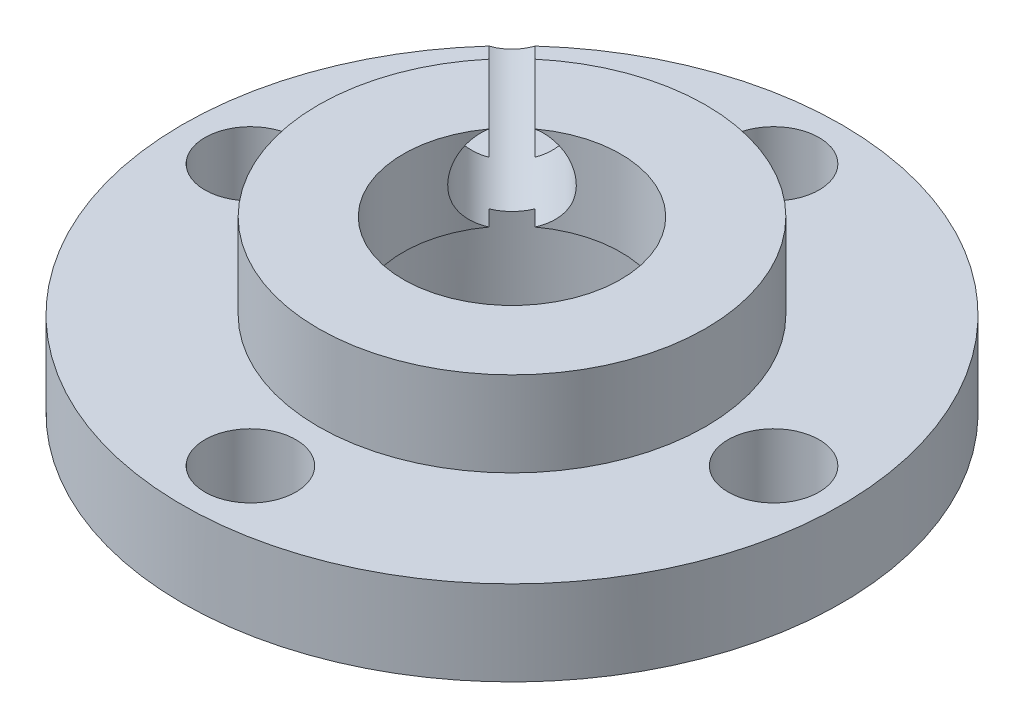
ISO-10303-21;
HEADER;
FILE_DESCRIPTION(('STEP AP214'),'2;1');
FILE_NAME('part.step','',(''),(''),'','','');
FILE_SCHEMA(('AUTOMOTIVE_DESIGN { 1 0 10303 214 1 1 1 1 }'));
ENDSEC;
DATA;
#1=APPLICATION_CONTEXT('core data for automotive mechanical design processes');
#2=APPLICATION_PROTOCOL_DEFINITION('international standard','automotive_design',2000,#1);
#3=PRODUCT_CONTEXT('',#1,'mechanical');
#4=PRODUCT('Part','Part','',(#3));
#5=PRODUCT_RELATED_PRODUCT_CATEGORY('part','',(#4));
#6=PRODUCT_DEFINITION_FORMATION('','',#4);
#7=PRODUCT_DEFINITION_CONTEXT('part definition',#1,'design');
#8=PRODUCT_DEFINITION('design','',#6,#7);
#9=PRODUCT_DEFINITION_SHAPE('','',#8);
#10=(LENGTH_UNIT() NAMED_UNIT(*) SI_UNIT(.MILLI.,.METRE.));
#11=(NAMED_UNIT(*) PLANE_ANGLE_UNIT() SI_UNIT($,.RADIAN.));
#12=(NAMED_UNIT(*) SI_UNIT($,.STERADIAN.) SOLID_ANGLE_UNIT());
#13=UNCERTAINTY_MEASURE_WITH_UNIT(LENGTH_MEASURE(1.E-05),#10,'distance_accuracy_value','');
#14=(GEOMETRIC_REPRESENTATION_CONTEXT(3) GLOBAL_UNCERTAINTY_ASSIGNED_CONTEXT((#13)) GLOBAL_UNIT_ASSIGNED_CONTEXT((#10,
#11,#12)) REPRESENTATION_CONTEXT('',''));
#15=CARTESIAN_POINT('',(0.,0.,0.));
#16=DIRECTION('',(0.,0.,1.));
#17=DIRECTION('',(1.,0.,0.));
#18=AXIS2_PLACEMENT_3D('',#15,#16,#17);
#19=CARTESIAN_POINT('',(0.,6.35,0.));
#20=DIRECTION('',(0.,-1.,0.));
#21=DIRECTION('',(0.,0.,-1.));
#22=AXIS2_PLACEMENT_3D('',#19,#20,#21);
#23=CYLINDRICAL_SURFACE('',#22,4.064);
#24=CARTESIAN_POINT('',(0.,6.35,0.));
#25=DIRECTION('',(0.,1.,0.));
#26=DIRECTION('',(0.,0.,1.));
#27=AXIS2_PLACEMENT_3D('',#24,#25,#26);
#28=CIRCLE('',#27,4.064);
#29=CARTESIAN_POINT('',(-3.27135014834623,6.35,-2.41129927775775));
#30=VERTEX_POINT('',#29);
#31=CARTESIAN_POINT('',(-2.41129927775775,6.35,-3.27135014834624));
#32=VERTEX_POINT('',#31);
#33=EDGE_CURVE('E49',#30,#32,#28,.T.);
#34=ORIENTED_EDGE('',*,*,#33,.T.);
#35=CARTESIAN_POINT('',(-2.41129927775775,6.35,-3.27135014834624));
#36=CARTESIAN_POINT('',(-2.37440094025534,6.33263612390318,-3.29855168814195));
#37=CARTESIAN_POINT('',(-2.33764333070745,6.31337561891872,-3.32467742121239));
#38=CARTESIAN_POINT('',(-2.2647505005685,6.27123559738762,-3.37475203404328));
#39=CARTESIAN_POINT('',(-2.22861502818188,6.24835758503293,-3.39870181209656));
#40=CARTESIAN_POINT('',(-2.12177277996869,6.17464883817413,-3.46717556053788));
#41=CARTESIAN_POINT('',(-2.05245560799213,6.11866108290522,-3.5084505215613));
#42=CARTESIAN_POINT('',(-1.92052660747704,5.99468371639283,-3.58237427375964));
#43=CARTESIAN_POINT('',(-1.8579076453817,5.92670708186172,-3.61503229742303));
#44=CARTESIAN_POINT('',(-1.74188324560806,5.78022961814905,-3.67234648673477));
#45=CARTESIAN_POINT('',(-1.68848240415476,5.70172357338939,-3.69699866597588));
#46=CARTESIAN_POINT('',(-1.59262834598441,5.53417269603624,-3.73931076389728));
#47=CARTESIAN_POINT('',(-1.550432927703,5.44493879440966,-3.75681032784123));
#48=CARTESIAN_POINT('',(-1.48132713032649,5.2596982805523,-3.78459636816476));
#49=CARTESIAN_POINT('',(-1.45440476171118,5.16369704750339,-3.79488850395072));
#50=CARTESIAN_POINT('',(-1.4191954689404,4.97454088279959,-3.80819027973331));
#51=CARTESIAN_POINT('',(-1.40977807997907,4.88162803185472,-3.81164272369007));
#52=CARTESIAN_POINT('',(-1.40683525448916,4.69552992036324,-3.812730911018));
#53=CARTESIAN_POINT('',(-1.41330489128958,4.60234475321476,-3.81036845762648));
#54=CARTESIAN_POINT('',(-1.44070795823759,4.4244883375371,-3.80008470474155));
#55=CARTESIAN_POINT('',(-1.46070972460134,4.33964946941976,-3.79252098320652));
#56=CARTESIAN_POINT('',(-1.51290623978593,4.17451365711141,-3.77200095199514));
#57=CARTESIAN_POINT('',(-1.54510296011141,4.09421744972614,-3.75904377034824));
#58=CARTESIAN_POINT('',(-1.62162567806188,3.93642293892217,-3.72669042685377));
#59=CARTESIAN_POINT('',(-1.66643144278085,3.85921221676841,-3.70703123579874));
#60=CARTESIAN_POINT('',(-1.76531160812997,3.71311934967038,-3.660975525354));
#61=CARTESIAN_POINT('',(-1.819394118313,3.64424458247595,-3.63457310120061));
#62=CARTESIAN_POINT('',(-1.93936462288245,3.51094619744083,-3.57210055109927));
#63=CARTESIAN_POINT('',(-2.00585783448897,3.44735510487964,-3.53541371012433));
#64=CARTESIAN_POINT('',(-2.14426598298613,3.33329427911413,-3.45320964962001));
#65=CARTESIAN_POINT('',(-2.21616938668447,3.28279760007027,-3.40771090606854));
#66=CARTESIAN_POINT('',(-2.30947261603164,3.22773913230588,-3.34410471454075));
#67=CARTESIAN_POINT('',(-2.32976129973482,3.21638237731115,-3.33000504654438));
#68=CARTESIAN_POINT('',(-2.37045141810175,3.19482467368575,-3.30116260439579));
#69=CARTESIAN_POINT('',(-2.39085268796998,3.18462235249359,-3.28642062344278));
#70=CARTESIAN_POINT('',(-2.41129927775775,3.17499999999998,-3.27135014834624));
#71=B_SPLINE_CURVE_WITH_KNOTS('',3,(#35,#36,#37,#38,#39,#40,#41,#42,#43,#44,#45,#46,#47,#48,#49,
#50,#51,#52,#53,#54,#55,#56,#57,#58,#59,#60,#61,#62,#63,#64,#65,#66,#67,#68,#69,#70),
.UNSPECIFIED.,.F.,.F.,(4,2,2,2,2,2,2,2,2,2,2,2,2,2,2,2,2,4),(0.,0.146952928009524,
0.293844911587525,0.586945661560694,0.879731086045119,1.17266207652252,1.47184106083636,
1.77078486004526,2.04964481064598,2.32841829586645,2.58972454782627,2.85107306206325,
3.12415814609943,3.39748318398533,3.69329745182157,3.98849807028332,4.07005224113133,
4.15150840623023),.UNSPECIFIED.);
#72=CARTESIAN_POINT('',(-2.41129927775776,3.175,-3.27135014834623));
#73=VERTEX_POINT('',#72);
#74=EDGE_CURVE('E91',#32,#73,#71,.T.);
#75=ORIENTED_EDGE('',*,*,#74,.T.);
#76=CARTESIAN_POINT('',(0.,3.175,0.));
#77=DIRECTION('',(0.,-1.,0.));
#78=DIRECTION('',(0.,0.,-1.));
#79=AXIS2_PLACEMENT_3D('',#76,#77,#78);
#80=CIRCLE('',#79,4.064);
#81=CARTESIAN_POINT('',(-3.27135014834623,3.175,-2.41129927775776));
#82=VERTEX_POINT('',#81);
#83=EDGE_CURVE('E44',#73,#82,#80,.T.);
#84=ORIENTED_EDGE('',*,*,#83,.T.);
#85=CARTESIAN_POINT('',(-3.27135014834623,3.175,-2.41129927775776));
#86=CARTESIAN_POINT('',(-3.29855168814194,3.19236387609682,-2.37440094025534));
#87=CARTESIAN_POINT('',(-3.32467742121239,3.21162438108128,-2.33764333070746));
#88=CARTESIAN_POINT('',(-3.37475203404328,3.25376440261238,-2.26475050056851));
#89=CARTESIAN_POINT('',(-3.39870181209655,3.27664241496707,-2.22861502818188));
#90=CARTESIAN_POINT('',(-3.46717556053788,3.35035116182587,-2.1217727799687));
#91=CARTESIAN_POINT('',(-3.50845052156129,3.40633891709478,-2.05245560799214));
#92=CARTESIAN_POINT('',(-3.58237427375963,3.53031628360717,-1.92052660747705));
#93=CARTESIAN_POINT('',(-3.61503229742303,3.59829291813828,-1.85790764538171));
#94=CARTESIAN_POINT('',(-3.67234648673476,3.74477038185095,-1.74188324560806));
#95=CARTESIAN_POINT('',(-3.69699866597588,3.8232764266106,-1.68848240415477));
#96=CARTESIAN_POINT('',(-3.73931076389728,3.99082730396376,-1.59262834598441));
#97=CARTESIAN_POINT('',(-3.75681032784122,4.08006120559034,-1.550432927703));
#98=CARTESIAN_POINT('',(-3.78459636816476,4.2653017194477,-1.4813271303265));
#99=CARTESIAN_POINT('',(-3.79488850395072,4.36130295249661,-1.45440476171119));
#100=CARTESIAN_POINT('',(-3.8081902797333,4.55045911720041,-1.4191954689404));
#101=CARTESIAN_POINT('',(-3.81164272369007,4.64337196814528,-1.40977807997908));
#102=CARTESIAN_POINT('',(-3.812730911018,4.82947007963676,-1.40683525448916));
#103=CARTESIAN_POINT('',(-3.81036845762648,4.92265524678524,-1.41330489128958));
#104=CARTESIAN_POINT('',(-3.80008470474155,5.1005116624629,-1.4407079582376));
#105=CARTESIAN_POINT('',(-3.79252098320652,5.18535053058024,-1.46070972460134));
#106=CARTESIAN_POINT('',(-3.77200095199514,5.35048634288859,-1.51290623978593));
#107=CARTESIAN_POINT('',(-3.75904377034824,5.43078255027386,-1.54510296011141));
#108=CARTESIAN_POINT('',(-3.72669042685377,5.58857706107783,-1.62162567806189));
#109=CARTESIAN_POINT('',(-3.70703123579873,5.66578778323159,-1.66643144278085));
#110=CARTESIAN_POINT('',(-3.66097552535399,5.81188065032962,-1.76531160812998));
#111=CARTESIAN_POINT('',(-3.63457310120061,5.88075541752405,-1.819394118313));
#112=CARTESIAN_POINT('',(-3.57210055109926,6.01405380255917,-1.93936462288245));
#113=CARTESIAN_POINT('',(-3.53541371012433,6.07764489512036,-2.00585783448897));
#114=CARTESIAN_POINT('',(-3.45320964962001,6.19170572088588,-2.14426598298613));
#115=CARTESIAN_POINT('',(-3.40771090606854,6.24220239992974,-2.21616938668447));
#116=CARTESIAN_POINT('',(-3.34410471454075,6.29726086769412,-2.30947261603164));
#117=CARTESIAN_POINT('',(-3.33000504654438,6.30861762268885,-2.32976129973482));
#118=CARTESIAN_POINT('',(-3.30116260439579,6.33017532631425,-2.37045141810175));
#119=CARTESIAN_POINT('',(-3.28642062344278,6.34037764750641,-2.39085268796997));
#120=CARTESIAN_POINT('',(-3.27135014834624,6.35000000000002,-2.41129927775775));
#121=B_SPLINE_CURVE_WITH_KNOTS('',3,(#85,#86,#87,#88,#89,#90,#91,#92,#93,#94,#95,#96,#97,#98,
#99,#100,#101,#102,#103,#104,#105,#106,#107,#108,#109,#110,#111,#112,#113,#114,#115,#116,#117,
#118,#119,#120),.UNSPECIFIED.,.F.,.F.,(4,2,2,2,2,2,2,2,2,2,2,2,2,2,2,2,2,4),(0.,
0.146952928009524,0.293844911587525,0.586945661560695,0.879731086045121,1.17266207652252,
1.47184106083636,1.77078486004526,2.04964481064598,2.32841829586645,2.58972454782627,
2.85107306206325,3.12415814609944,3.39748318398533,3.69329745182158,3.98849807028332,
4.07005224113133,4.15150840623023),.UNSPECIFIED.);
#122=EDGE_CURVE('E56',#82,#30,#121,.T.);
#123=ORIENTED_EDGE('',*,*,#122,.T.);
#124=EDGE_LOOP('',(#34,#75,#84,#123));
#125=FACE_BOUND('',#124,.T.);
#126=ADVANCED_FACE('F41',(#125),#23,.F.);
#127=CARTESIAN_POINT('',(0.,6.35,0.));
#128=DIRECTION('',(0.,-1.,0.));
#129=DIRECTION('',(0.,0.,-1.));
#130=AXIS2_PLACEMENT_3D('',#127,#128,#129);
#131=CYLINDRICAL_SURFACE('',#130,7.239);
#132=CARTESIAN_POINT('',(-4.67062536876989,3.175,-5.53067623935836));
#133=CARTESIAN_POINT('',(-4.63621860877674,3.19219204762246,-5.55973504176745));
#134=CARTESIAN_POINT('',(-4.60210827736189,3.21126819797706,-5.58798800516102));
#135=CARTESIAN_POINT('',(-4.53475614265199,3.25304888518788,-5.64278189598371));
#136=CARTESIAN_POINT('',(-4.50151420132915,3.27575284128293,-5.66932309648925));
#137=CARTESIAN_POINT('',(-4.40360091863712,3.34902137525218,-5.74615346488033));
#138=CARTESIAN_POINT('',(-4.34062127855916,3.40480303538194,-5.79375053671295));
#139=CARTESIAN_POINT('',(-4.22166736969987,3.52861362136068,-5.88099558917958));
#140=CARTESIAN_POINT('',(-4.16569312338473,3.59664258648489,-5.92064354432112));
#141=CARTESIAN_POINT('',(-4.06289232849703,3.74315089020105,-5.99165537389692));
#142=CARTESIAN_POINT('',(-4.01606539467719,3.82162978845048,-6.02301959722757));
#143=CARTESIAN_POINT('',(-3.93332330224434,3.98740143388153,-6.0773813690947));
#144=CARTESIAN_POINT('',(-3.89746907807281,4.07473993734672,-6.10033233094152));
#145=CARTESIAN_POINT('',(-3.83870302709042,4.25543625395897,-6.1374830445905));
#146=CARTESIAN_POINT('',(-3.8157902709371,4.34879363434665,-6.15168342478916));
#147=CARTESIAN_POINT('',(-3.78439998726266,4.53680898679293,-6.17104322271558));
#148=CARTESIAN_POINT('',(-3.77563353794368,4.63140006053522,-6.17638366005477));
#149=CARTESIAN_POINT('',(-3.77207821998139,4.82093300669603,-6.17855588892961));
#150=CARTESIAN_POINT('',(-3.77728729274391,4.9158748253926,-6.17538893360396));
#151=CARTESIAN_POINT('',(-3.80118516463577,5.10158518919911,-6.16070605294302));
#152=CARTESIAN_POINT('',(-3.81962425979223,5.19239837473461,-6.14934476725139));
#153=CARTESIAN_POINT('',(-3.86881840084993,5.3691723055207,-6.11851297064617));
#154=CARTESIAN_POINT('',(-3.89957358157554,5.4551329976392,-6.0990423709597));
#155=CARTESIAN_POINT('',(-3.97249566566733,5.62101005199987,-6.05180162764155));
#156=CARTESIAN_POINT('',(-4.01480363731538,5.70083493418024,-6.02392841262452));
#157=CARTESIAN_POINT('',(-4.10891004566911,5.85119554044087,-5.96013433691424));
#158=CARTESIAN_POINT('',(-4.16071437535746,5.92172544953295,-5.92420847603576));
#159=CARTESIAN_POINT('',(-4.27318543502546,6.05326654091409,-5.84362143755651));
#160=CARTESIAN_POINT('',(-4.33404101281346,6.11399636902945,-5.79876470069513));
#161=CARTESIAN_POINT('',(-4.46121027281229,6.22195669346998,-5.70149786393153));
#162=CARTESIAN_POINT('',(-4.52751188651988,6.2692160536036,-5.64910428190093));
#163=CARTESIAN_POINT('',(-4.62023503093794,6.32372988168808,-5.57293618892688));
#164=CARTESIAN_POINT('',(-4.64536096585342,6.3373831214665,-5.55201653478122));
#165=CARTESIAN_POINT('',(-4.67062536876988,6.35,-5.53067623935837));
#166=B_SPLINE_CURVE_WITH_KNOTS('',3,(#132,#133,#134,#135,#136,#137,#138,#139,#140,#141,#142,
#143,#144,#145,#146,#147,#148,#149,#150,#151,#152,#153,#154,#155,#156,#157,#158,#159,#160,#161,
#162,#163,#164,#165),.UNSPECIFIED.,.F.,.F.,(4,2,2,2,2,2,2,2,2,2,2,2,2,2,2,2,4),(0.,
0.144524111911679,0.28902511066314,0.577527344526546,0.866030503589091,1.15452150946125,
1.44458667012832,1.73463099821648,2.01867290440175,2.30267297351642,2.58144923982888,
2.86022855799278,3.14257722652449,3.42510170385607,3.71467423284221,4.00362153470761,
4.10984006205164),.UNSPECIFIED.);
#167=CARTESIAN_POINT('',(-4.67062536876989,3.175,-5.53067623935836));
#168=VERTEX_POINT('',#167);
#169=CARTESIAN_POINT('',(-4.67062536876988,6.35,-5.53067623935837));
#170=VERTEX_POINT('',#169);
#171=EDGE_CURVE('E168',#168,#170,#166,.T.);
#172=ORIENTED_EDGE('',*,*,#171,.T.);
#173=CARTESIAN_POINT('',(0.,6.35,0.));
#174=DIRECTION('',(0.,1.,0.));
#175=DIRECTION('',(0.,0.,1.));
#176=AXIS2_PLACEMENT_3D('',#173,#174,#175);
#177=CIRCLE('',#176,7.239);
#178=CARTESIAN_POINT('',(-5.53067623935837,6.35,-4.67062536876988));
#179=VERTEX_POINT('',#178);
#180=EDGE_CURVE('E11',#179,#170,#177,.T.);
#181=ORIENTED_EDGE('',*,*,#180,.F.);
#182=CARTESIAN_POINT('',(-5.53067623935837,6.35,-4.67062536876988));
#183=CARTESIAN_POINT('',(-5.55973504176746,6.33280795237754,-4.63621860877674));
#184=CARTESIAN_POINT('',(-5.58798800516103,6.31373180202293,-4.60210827736188));
#185=CARTESIAN_POINT('',(-5.64278189598371,6.27195111481212,-4.53475614265198));
#186=CARTESIAN_POINT('',(-5.66932309648925,6.24924715871707,-4.50151420132915));
#187=CARTESIAN_POINT('',(-5.74615346488033,6.17597862474782,-4.40360091863711));
#188=CARTESIAN_POINT('',(-5.79375053671295,6.12019696461806,-4.34062127855916));
#189=CARTESIAN_POINT('',(-5.88099558917958,5.99638637863932,-4.22166736969986));
#190=CARTESIAN_POINT('',(-5.92064354432113,5.92835741351511,-4.16569312338472));
#191=CARTESIAN_POINT('',(-5.99165537389693,5.78184910979895,-4.06289232849702));
#192=CARTESIAN_POINT('',(-6.02301959722758,5.70337021154952,-4.01606539467718));
#193=CARTESIAN_POINT('',(-6.0773813690947,5.53759856611847,-3.93332330224434));
#194=CARTESIAN_POINT('',(-6.10033233094152,5.45026006265328,-3.8974690780728));
#195=CARTESIAN_POINT('',(-6.1374830445905,5.26956374604103,-3.83870302709041));
#196=CARTESIAN_POINT('',(-6.15168342478916,5.17620636565334,-3.8157902709371));
#197=CARTESIAN_POINT('',(-6.17104322271558,4.98819101320706,-3.78439998726266));
#198=CARTESIAN_POINT('',(-6.17638366005477,4.89359993946477,-3.77563353794368));
#199=CARTESIAN_POINT('',(-6.17855588892961,4.70406699330397,-3.77207821998138));
#200=CARTESIAN_POINT('',(-6.17538893360396,4.6091251746074,-3.7772872927439));
#201=CARTESIAN_POINT('',(-6.16070605294302,4.42341481080089,-3.80118516463577));
#202=CARTESIAN_POINT('',(-6.14934476725139,4.33260162526538,-3.81962425979224));
#203=CARTESIAN_POINT('',(-6.11851297064617,4.1558276944793,-3.86881840084994));
#204=CARTESIAN_POINT('',(-6.0990423709597,4.06986700236079,-3.89957358157555));
#205=CARTESIAN_POINT('',(-6.05180162764155,3.90398994800013,-3.97249566566733));
#206=CARTESIAN_POINT('',(-6.02392841262452,3.82416506581976,-4.01480363731538));
#207=CARTESIAN_POINT('',(-5.96013433691424,3.67380445955913,-4.10891004566911));
#208=CARTESIAN_POINT('',(-5.92420847603575,3.60327455046705,-4.16071437535747));
#209=CARTESIAN_POINT('',(-5.84362143755651,3.4717334590859,-4.27318543502547));
#210=CARTESIAN_POINT('',(-5.79876470069513,3.41100363097055,-4.33404101281346));
#211=CARTESIAN_POINT('',(-5.70149786393153,3.30304330653002,-4.4612102728123));
#212=CARTESIAN_POINT('',(-5.64910428190093,3.2557839463964,-4.52751188651988));
#213=CARTESIAN_POINT('',(-5.57293618892687,3.20127011831192,-4.62023503093794));
#214=CARTESIAN_POINT('',(-5.55201653478122,3.1876168785335,-4.64536096585343));
#215=CARTESIAN_POINT('',(-5.53067623935836,3.175,-4.67062536876989));
#216=B_SPLINE_CURVE_WITH_KNOTS('',3,(#182,#183,#184,#185,#186,#187,#188,#189,#190,#191,#192,
#193,#194,#195,#196,#197,#198,#199,#200,#201,#202,#203,#204,#205,#206,#207,#208,#209,#210,#211,
#212,#213,#214,#215),.UNSPECIFIED.,.F.,.F.,(4,2,2,2,2,2,2,2,2,2,2,2,2,2,2,2,4),(0.,
0.14452411191168,0.289025110663142,0.577527344526547,0.866030503589092,1.15452150946125,
1.44458667012832,1.73463099821649,2.01867290440175,2.30267297351642,2.58144923982888,
2.86022855799278,3.14257722652449,3.42510170385607,3.71467423284221,4.00362153470762,
4.10984006205164),.UNSPECIFIED.);
#217=CARTESIAN_POINT('',(-5.53067623935836,3.175,-4.67062536876989));
#218=VERTEX_POINT('',#217);
#219=EDGE_CURVE('E62',#179,#218,#216,.T.);
#220=ORIENTED_EDGE('',*,*,#219,.T.);
#221=CARTESIAN_POINT('',(0.,3.175,0.));
#222=DIRECTION('',(0.,1.,0.));
#223=DIRECTION('',(0.,0.,1.));
#224=AXIS2_PLACEMENT_3D('',#221,#222,#223);
#225=CIRCLE('',#224,7.239);
#226=EDGE_CURVE('E114',#218,#168,#225,.T.);
#227=ORIENTED_EDGE('',*,*,#226,.T.);
#228=EDGE_LOOP('',(#172,#181,#220,#227));
#229=FACE_BOUND('',#228,.T.);
#230=ADVANCED_FACE('F225',(#229),#131,.T.);
#231=CARTESIAN_POINT('',(0.,6.35,0.));
#232=DIRECTION('',(0.,1.,0.));
#233=DIRECTION('',(0.,0.,1.));
#234=AXIS2_PLACEMENT_3D('',#231,#232,#233);
#235=PLANE('',#234);
#236=ORIENTED_EDGE('',*,*,#33,.F.);
#237=DIRECTION('',(0.707106781186548,0.,0.707106781186548));
#238=VECTOR('',#237,1.);
#239=CARTESIAN_POINT('',(-12.7500254352942,6.35,-11.8899745647058));
#240=LINE('',#239,#238);
#241=EDGE_CURVE('E109',#179,#30,#240,.T.);
#242=ORIENTED_EDGE('',*,*,#241,.F.);
#243=ORIENTED_EDGE('',*,*,#180,.T.);
#244=DIRECTION('',(0.707106781186548,0.,0.707106781186548));
#245=VECTOR('',#244,1.);
#246=CARTESIAN_POINT('',(-11.8899745647058,6.35,-12.7500254352942));
#247=LINE('',#246,#245);
#248=EDGE_CURVE('E94',#32,#170,#247,.F.);
#249=ORIENTED_EDGE('',*,*,#248,.F.);
#250=EDGE_LOOP('',(#236,#242,#243,#249));
#251=FACE_BOUND('',#250,.T.);
#252=ADVANCED_FACE('F107',(#251),#235,.T.);
#253=CARTESIAN_POINT('',(0.,3.175,0.));
#254=DIRECTION('',(0.,-1.,0.));
#255=DIRECTION('',(0.,0.,-1.));
#256=AXIS2_PLACEMENT_3D('',#253,#254,#255);
#257=CYLINDRICAL_SURFACE('',#256,12.319);
#258=CARTESIAN_POINT('',(0.,0.,0.));
#259=DIRECTION('',(0.,1.,0.));
#260=DIRECTION('',(0.,0.,1.));
#261=AXIS2_PLACEMENT_3D('',#258,#259,#260);
#262=CIRCLE('',#261,12.319);
#263=CARTESIAN_POINT('',(0.,0.,12.319));
#264=VERTEX_POINT('',#263);
#265=EDGE_CURVE('E117',#264,#264,#262,.T.);
#266=ORIENTED_EDGE('',*,*,#265,.T.);
#267=EDGE_LOOP('',(#266));
#268=FACE_BOUND('',#267,.T.);
#269=CARTESIAN_POINT('',(-9.13025293950354,3.175,-8.27020206891507));
#270=CARTESIAN_POINT('',(-9.10052621012603,3.1580580696306,-8.30302174314196));
#271=CARTESIAN_POINT('',(-9.07016111713146,3.14296907512501,-8.3361868675608));
#272=CARTESIAN_POINT('',(-9.00831343685765,3.11658589602554,-8.40298281916933));
#273=CARTESIAN_POINT('',(-8.97683081957931,3.10529181338854,-8.436613658846));
#274=CARTESIAN_POINT('',(-8.88092455634505,3.07722970861658,-8.53788900738092));
#275=CARTESIAN_POINT('',(-8.81506453645765,3.06629438771387,-8.60589194269892));
#276=CARTESIAN_POINT('',(-8.68141840156005,3.06035809492221,-8.74069644929671));
#277=CARTESIAN_POINT('',(-8.61363083979152,3.06536942268801,-8.80749705326471));
#278=CARTESIAN_POINT('',(-8.4782215443161,3.09118427829824,-8.93791436081326));
#279=CARTESIAN_POINT('',(-8.41059984099897,3.11194643477466,-9.00153894075191));
#280=CARTESIAN_POINT('',(-8.33173118281587,3.14549122068173,-9.07415596609026));
#281=CARTESIAN_POINT('',(-8.31935657868675,3.15103365111673,-9.08550210448849));
#282=CARTESIAN_POINT('',(-8.29470655405704,3.16263211769681,-9.10801185589206));
#283=CARTESIAN_POINT('',(-8.28243105006846,3.16868765792177,-9.11917563297529));
#284=CARTESIAN_POINT('',(-8.27020206891506,3.175,-9.13025293950354));
#285=B_SPLINE_CURVE_WITH_KNOTS('',3,(#269,#270,#271,#272,#273,#274,#275,#276,#277,#278,#279,
#280,#281,#282,#283,#284),.UNSPECIFIED.,.F.,.F.,(4,2,2,2,2,2,2,4),(0.,0.142146690733615,
0.284297200178683,0.568702475946614,0.853327166741373,1.13720683531144,1.19024374876841,
1.24322997435311),.UNSPECIFIED.);
#286=CARTESIAN_POINT('',(-9.13025293950354,3.175,-8.27020206891507));
#287=VERTEX_POINT('',#286);
#288=CARTESIAN_POINT('',(-8.27020206891506,3.175,-9.13025293950354));
#289=VERTEX_POINT('',#288);
#290=EDGE_CURVE('E174',#287,#289,#285,.T.);
#291=ORIENTED_EDGE('',*,*,#290,.T.);
#292=CARTESIAN_POINT('',(0.,3.175,0.));
#293=DIRECTION('',(0.,1.,0.));
#294=DIRECTION('',(0.,0.,1.));
#295=AXIS2_PLACEMENT_3D('',#292,#293,#294);
#296=CIRCLE('',#295,12.319);
#297=EDGE_CURVE('E111',#287,#289,#296,.T.);
#298=ORIENTED_EDGE('',*,*,#297,.F.);
#299=EDGE_LOOP('',(#291,#298));
#300=FACE_BOUND('',#299,.T.);
#301=ADVANCED_FACE('F220',(#268,#300),#257,.T.);
#302=CARTESIAN_POINT('',(0.,3.175,0.));
#303=DIRECTION('',(0.,1.,0.));
#304=DIRECTION('',(0.,0.,1.));
#305=AXIS2_PLACEMENT_3D('',#302,#303,#304);
#306=PLANE('',#305);
#307=CARTESIAN_POINT('',(0.,3.175,-9.779));
#308=DIRECTION('',(0.,1.,0.));
#309=DIRECTION('',(0.,0.,1.));
#310=AXIS2_PLACEMENT_3D('',#307,#308,#309);
#311=CIRCLE('',#310,1.7);
#312=CARTESIAN_POINT('',(0.,3.175,-8.079));
#313=VERTEX_POINT('',#312);
#314=EDGE_CURVE('E141',#313,#313,#311,.T.);
#315=ORIENTED_EDGE('',*,*,#314,.F.);
#316=EDGE_LOOP('',(#315));
#317=FACE_BOUND('',#316,.T.);
#318=CARTESIAN_POINT('',(9.779,3.175,0.));
#319=DIRECTION('',(0.,1.,0.));
#320=DIRECTION('',(0.,0.,1.));
#321=AXIS2_PLACEMENT_3D('',#318,#319,#320);
#322=CIRCLE('',#321,1.7);
#323=CARTESIAN_POINT('',(9.779,3.175,1.7));
#324=VERTEX_POINT('',#323);
#325=EDGE_CURVE('E138',#324,#324,#322,.T.);
#326=ORIENTED_EDGE('',*,*,#325,.F.);
#327=EDGE_LOOP('',(#326));
#328=FACE_BOUND('',#327,.T.);
#329=CARTESIAN_POINT('',(0.,3.175,9.779));
#330=DIRECTION('',(0.,1.,0.));
#331=DIRECTION('',(0.,0.,1.));
#332=AXIS2_PLACEMENT_3D('',#329,#330,#331);
#333=CIRCLE('',#332,1.7);
#334=CARTESIAN_POINT('',(0.,3.175,11.479));
#335=VERTEX_POINT('',#334);
#336=EDGE_CURVE('E132',#335,#335,#333,.T.);
#337=ORIENTED_EDGE('',*,*,#336,.F.);
#338=EDGE_LOOP('',(#337));
#339=FACE_BOUND('',#338,.T.);
#340=CARTESIAN_POINT('',(-9.779,3.175,0.));
#341=DIRECTION('',(0.,1.,0.));
#342=DIRECTION('',(0.,0.,1.));
#343=AXIS2_PLACEMENT_3D('',#340,#341,#342);
#344=CIRCLE('',#343,1.7);
#345=CARTESIAN_POINT('',(-9.779,3.175,1.7));
#346=VERTEX_POINT('',#345);
#347=EDGE_CURVE('E126',#346,#346,#344,.T.);
#348=ORIENTED_EDGE('',*,*,#347,.F.);
#349=EDGE_LOOP('',(#348));
#350=FACE_BOUND('',#349,.T.);
#351=ORIENTED_EDGE('',*,*,#226,.F.);
#352=DIRECTION('',(0.707106781186548,0.,0.707106781186548));
#353=VECTOR('',#352,1.);
#354=CARTESIAN_POINT('',(-12.7500254352942,3.175,-11.8899745647058));
#355=LINE('',#354,#353);
#356=EDGE_CURVE('E159',#287,#218,#355,.T.);
#357=ORIENTED_EDGE('',*,*,#356,.F.);
#358=ORIENTED_EDGE('',*,*,#297,.T.);
#359=DIRECTION('',(0.707106781186548,0.,0.707106781186548));
#360=VECTOR('',#359,1.);
#361=CARTESIAN_POINT('',(-11.8899745647058,3.175,-12.7500254352942));
#362=LINE('',#361,#360);
#363=EDGE_CURVE('E181',#168,#289,#362,.F.);
#364=ORIENTED_EDGE('',*,*,#363,.F.);
#365=EDGE_LOOP('',(#351,#357,#358,#364));
#366=FACE_BOUND('',#365,.T.);
#367=ADVANCED_FACE('F212',(#317,#328,#339,#350,#366),#306,.T.);
#368=CARTESIAN_POINT('',(0.,3.175,0.));
#369=DIRECTION('',(0.,-1.,0.));
#370=DIRECTION('',(0.,0.,-1.));
#371=AXIS2_PLACEMENT_3D('',#368,#369,#370);
#372=CYLINDRICAL_SURFACE('',#371,4.8895);
#373=CARTESIAN_POINT('',(0.,0.,0.));
#374=DIRECTION('',(0.,-1.,0.));
#375=DIRECTION('',(0.,0.,-1.));
#376=AXIS2_PLACEMENT_3D('',#373,#374,#375);
#377=CIRCLE('',#376,4.8895);
#378=CARTESIAN_POINT('',(0.,0.,-4.8895));
#379=VERTEX_POINT('',#378);
#380=EDGE_CURVE('E146',#379,#379,#377,.T.);
#381=ORIENTED_EDGE('',*,*,#380,.T.);
#382=EDGE_LOOP('',(#381));
#383=FACE_BOUND('',#382,.T.);
#384=CARTESIAN_POINT('',(-3.86057688513433,3.175,-3.00052601454586));
#385=CARTESIAN_POINT('',(-3.83442304111476,3.15879981346931,-3.03417966021023));
#386=CARTESIAN_POINT('',(-3.80744651290684,3.14427649843976,-3.06797576680603));
#387=CARTESIAN_POINT('',(-3.75194216473871,3.11868425453576,-3.13561060082885));
#388=CARTESIAN_POINT('',(-3.72341410464991,3.10761586217198,-3.16944933405695));
#389=CARTESIAN_POINT('',(-3.6356861232735,3.07976031499053,-3.27061580320826));
#390=CARTESIAN_POINT('',(-3.57431559579632,3.06830610328449,-3.33762854559269));
#391=CARTESIAN_POINT('',(-3.44737010391273,3.06010891290166,-3.46860176251013));
#392=CARTESIAN_POINT('',(-3.38178924634033,3.06338701783157,-3.53255773017865));
#393=CARTESIAN_POINT('',(-3.2485174450696,3.08456269819662,-3.65547915719629));
#394=CARTESIAN_POINT('',(-3.18083117605263,3.1024298388339,-3.7144547240156));
#395=CARTESIAN_POINT('',(-3.09441137581921,3.13412017273076,-3.78582013462626));
#396=CARTESIAN_POINT('',(-3.07558116275334,3.14156555865253,-3.80113076701914));
#397=CARTESIAN_POINT('',(-3.03799538553153,3.15750231091549,-3.83123602190552));
#398=CARTESIAN_POINT('',(-3.01923975610355,3.16599230275967,-3.84603129029331));
#399=CARTESIAN_POINT('',(-3.00052601454586,3.175,-3.86057688513434));
#400=B_SPLINE_CURVE_WITH_KNOTS('',3,(#384,#385,#386,#387,#388,#389,#390,#391,#392,#393,#394,
#395,#396,#397,#398,#399),.UNSPECIFIED.,.F.,.F.,(4,2,2,2,2,2,2,4),(0.,0.136711437775546,
0.2734440947519,0.546770342272645,0.820487874942407,1.09363584849463,1.16977597299498,
1.24581696240549),.UNSPECIFIED.);
#401=CARTESIAN_POINT('',(-3.86057688513433,3.175,-3.00052601454586));
#402=VERTEX_POINT('',#401);
#403=CARTESIAN_POINT('',(-3.00052601454586,3.175,-3.86057688513434));
#404=VERTEX_POINT('',#403);
#405=EDGE_CURVE('E103',#402,#404,#400,.T.);
#406=ORIENTED_EDGE('',*,*,#405,.F.);
#407=CARTESIAN_POINT('',(0.,3.175,0.));
#408=DIRECTION('',(0.,-1.,0.));
#409=DIRECTION('',(0.,0.,-1.));
#410=AXIS2_PLACEMENT_3D('',#407,#408,#409);
#411=CIRCLE('',#410,4.8895);
#412=EDGE_CURVE('E149',#404,#402,#411,.T.);
#413=ORIENTED_EDGE('',*,*,#412,.F.);
#414=EDGE_LOOP('',(#406,#413));
#415=FACE_BOUND('',#414,.T.);
#416=ADVANCED_FACE('F210',(#383,#415),#372,.F.);
#417=CARTESIAN_POINT('',(0.,3.175,0.));
#418=DIRECTION('',(0.,-1.,0.));
#419=DIRECTION('',(0.,0.,-1.));
#420=AXIS2_PLACEMENT_3D('',#417,#418,#419);
#421=PLANE('',#420);
#422=ORIENTED_EDGE('',*,*,#83,.F.);
#423=DIRECTION('',(-0.707106781186548,0.,-0.707106781186547));
#424=VECTOR('',#423,1.);
#425=CARTESIAN_POINT('',(12.7500254352942,3.175,11.8899745647058));
#426=LINE('',#425,#424);
#427=EDGE_CURVE('E97',#73,#404,#426,.T.);
#428=ORIENTED_EDGE('',*,*,#427,.T.);
#429=ORIENTED_EDGE('',*,*,#412,.T.);
#430=DIRECTION('',(-0.707106781186548,0.,-0.707106781186547));
#431=VECTOR('',#430,1.);
#432=CARTESIAN_POINT('',(11.8899745647058,3.175,12.7500254352942));
#433=LINE('',#432,#431);
#434=EDGE_CURVE('E102',#402,#82,#433,.F.);
#435=ORIENTED_EDGE('',*,*,#434,.T.);
#436=EDGE_LOOP('',(#422,#428,#429,#435));
#437=FACE_BOUND('',#436,.T.);
#438=ADVANCED_FACE('F207',(#437),#421,.T.);
#439=CARTESIAN_POINT('',(0.,0.,0.));
#440=DIRECTION('',(0.,1.,0.));
#441=DIRECTION('',(0.,0.,1.));
#442=AXIS2_PLACEMENT_3D('',#439,#440,#441);
#443=PLANE('',#442);
#444=ORIENTED_EDGE('',*,*,#380,.F.);
#445=EDGE_LOOP('',(#444));
#446=FACE_BOUND('',#445,.T.);
#447=CARTESIAN_POINT('',(0.,0.,-9.779));
#448=DIRECTION('',(0.,1.,0.));
#449=DIRECTION('',(0.,0.,1.));
#450=AXIS2_PLACEMENT_3D('',#447,#448,#449);
#451=CIRCLE('',#450,1.7);
#452=CARTESIAN_POINT('',(0.,0.,-8.079));
#453=VERTEX_POINT('',#452);
#454=EDGE_CURVE('E119',#453,#453,#451,.T.);
#455=ORIENTED_EDGE('',*,*,#454,.T.);
#456=EDGE_LOOP('',(#455));
#457=FACE_BOUND('',#456,.T.);
#458=CARTESIAN_POINT('',(9.779,0.,0.));
#459=DIRECTION('',(0.,1.,0.));
#460=DIRECTION('',(0.,0.,1.));
#461=AXIS2_PLACEMENT_3D('',#458,#459,#460);
#462=CIRCLE('',#461,1.7);
#463=CARTESIAN_POINT('',(9.779,0.,1.7));
#464=VERTEX_POINT('',#463);
#465=EDGE_CURVE('E135',#464,#464,#462,.T.);
#466=ORIENTED_EDGE('',*,*,#465,.T.);
#467=EDGE_LOOP('',(#466));
#468=FACE_BOUND('',#467,.T.);
#469=CARTESIAN_POINT('',(0.,0.,9.779));
#470=DIRECTION('',(0.,1.,0.));
#471=DIRECTION('',(0.,0.,1.));
#472=AXIS2_PLACEMENT_3D('',#469,#470,#471);
#473=CIRCLE('',#472,1.7);
#474=CARTESIAN_POINT('',(0.,0.,11.479));
#475=VERTEX_POINT('',#474);
#476=EDGE_CURVE('E129',#475,#475,#473,.T.);
#477=ORIENTED_EDGE('',*,*,#476,.T.);
#478=EDGE_LOOP('',(#477));
#479=FACE_BOUND('',#478,.T.);
#480=CARTESIAN_POINT('',(-9.779,0.,0.));
#481=DIRECTION('',(0.,1.,0.));
#482=DIRECTION('',(0.,0.,1.));
#483=AXIS2_PLACEMENT_3D('',#480,#481,#482);
#484=CIRCLE('',#483,1.7);
#485=CARTESIAN_POINT('',(-9.779,0.,1.7));
#486=VERTEX_POINT('',#485);
#487=EDGE_CURVE('E123',#486,#486,#484,.T.);
#488=ORIENTED_EDGE('',*,*,#487,.T.);
#489=EDGE_LOOP('',(#488));
#490=FACE_BOUND('',#489,.T.);
#491=ORIENTED_EDGE('',*,*,#265,.F.);
#492=EDGE_LOOP('',(#491));
#493=FACE_BOUND('',#492,.T.);
#494=ADVANCED_FACE('F219',(#446,#457,#468,#479,#490,#493),#443,.F.);
#495=CARTESIAN_POINT('',(-9.779,0.,0.));
#496=DIRECTION('',(0.,1.,0.));
#497=DIRECTION('',(0.,0.,1.));
#498=AXIS2_PLACEMENT_3D('',#495,#496,#497);
#499=CYLINDRICAL_SURFACE('',#498,1.7);
#500=ORIENTED_EDGE('',*,*,#487,.F.);
#501=EDGE_LOOP('',(#500));
#502=FACE_BOUND('',#501,.T.);
#503=ORIENTED_EDGE('',*,*,#347,.T.);
#504=EDGE_LOOP('',(#503));
#505=FACE_BOUND('',#504,.T.);
#506=ADVANCED_FACE('F236',(#502,#505),#499,.F.);
#507=CARTESIAN_POINT('',(0.,0.,9.779));
#508=DIRECTION('',(0.,1.,0.));
#509=DIRECTION('',(0.,0.,1.));
#510=AXIS2_PLACEMENT_3D('',#507,#508,#509);
#511=CYLINDRICAL_SURFACE('',#510,1.7);
#512=ORIENTED_EDGE('',*,*,#476,.F.);
#513=EDGE_LOOP('',(#512));
#514=FACE_BOUND('',#513,.T.);
#515=ORIENTED_EDGE('',*,*,#336,.T.);
#516=EDGE_LOOP('',(#515));
#517=FACE_BOUND('',#516,.T.);
#518=ADVANCED_FACE('F244',(#514,#517),#511,.F.);
#519=CARTESIAN_POINT('',(9.779,0.,0.));
#520=DIRECTION('',(0.,1.,0.));
#521=DIRECTION('',(0.,0.,1.));
#522=AXIS2_PLACEMENT_3D('',#519,#520,#521);
#523=CYLINDRICAL_SURFACE('',#522,1.7);
#524=ORIENTED_EDGE('',*,*,#465,.F.);
#525=EDGE_LOOP('',(#524));
#526=FACE_BOUND('',#525,.T.);
#527=ORIENTED_EDGE('',*,*,#325,.T.);
#528=EDGE_LOOP('',(#527));
#529=FACE_BOUND('',#528,.T.);
#530=ADVANCED_FACE('F248',(#526,#529),#523,.F.);
#531=CARTESIAN_POINT('',(0.,0.,-9.779));
#532=DIRECTION('',(0.,1.,0.));
#533=DIRECTION('',(0.,0.,1.));
#534=AXIS2_PLACEMENT_3D('',#531,#532,#533);
#535=CYLINDRICAL_SURFACE('',#534,1.7);
#536=ORIENTED_EDGE('',*,*,#454,.F.);
#537=EDGE_LOOP('',(#536));
#538=FACE_BOUND('',#537,.T.);
#539=ORIENTED_EDGE('',*,*,#314,.T.);
#540=EDGE_LOOP('',(#539));
#541=FACE_BOUND('',#540,.T.);
#542=ADVANCED_FACE('F251',(#538,#541),#535,.F.);
#543=CARTESIAN_POINT('',(-12.32,4.7625,-12.32));
#544=DIRECTION('',(0.707106781186548,0.,0.707106781186548));
#545=DIRECTION('',(0.707106781186547,0.,-0.707106781186548));
#546=AXIS2_PLACEMENT_3D('',#543,#544,#545);
#547=CYLINDRICAL_SURFACE('',#546,1.7);
#548=ORIENTED_EDGE('',*,*,#241,.T.);
#549=ORIENTED_EDGE('',*,*,#122,.F.);
#550=ORIENTED_EDGE('',*,*,#434,.F.);
#551=ORIENTED_EDGE('',*,*,#405,.T.);
#552=ORIENTED_EDGE('',*,*,#427,.F.);
#553=ORIENTED_EDGE('',*,*,#74,.F.);
#554=ORIENTED_EDGE('',*,*,#248,.T.);
#555=ORIENTED_EDGE('',*,*,#171,.F.);
#556=ORIENTED_EDGE('',*,*,#363,.T.);
#557=ORIENTED_EDGE('',*,*,#290,.F.);
#558=ORIENTED_EDGE('',*,*,#356,.T.);
#559=ORIENTED_EDGE('',*,*,#219,.F.);
#560=EDGE_LOOP('',(#548,#549,#550,#551,#552,#553,#554,#555,#556,#557,#558,#559));
#561=FACE_BOUND('',#560,.T.);
#562=ADVANCED_FACE('F93',(#561),#547,.F.);
#563=CLOSED_SHELL('',(#126,#230,#252,#301,#367,#416,#438,#494,#506,#518,#530,#542,#562));
#564=MANIFOLD_SOLID_BREP('B2',#563);
#565=ADVANCED_BREP_SHAPE_REPRESENTATION('',(#18,#564),#14);
#566=SHAPE_DEFINITION_REPRESENTATION(#9,#565);
ENDSEC;
END-ISO-10303-21;
